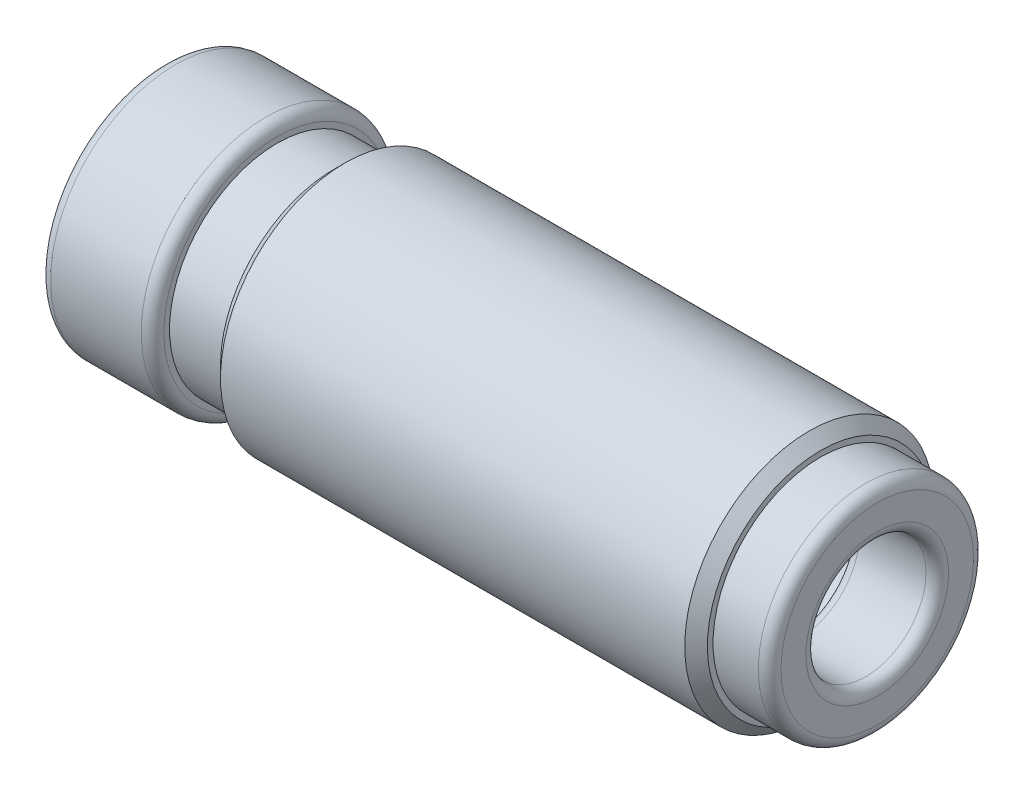
ISO-10303-21;
HEADER;
FILE_DESCRIPTION(('STEP AP214'),'2;1');
FILE_NAME('part.step','',(''),(''),'','','');
FILE_SCHEMA(('AUTOMOTIVE_DESIGN { 1 0 10303 214 1 1 1 1 }'));
ENDSEC;
DATA;
#1=APPLICATION_CONTEXT('core data for automotive mechanical design processes');
#2=APPLICATION_PROTOCOL_DEFINITION('international standard','automotive_design',2000,#1);
#3=PRODUCT_CONTEXT('',#1,'mechanical');
#4=PRODUCT('Part','Part','',(#3));
#5=PRODUCT_RELATED_PRODUCT_CATEGORY('part','',(#4));
#6=PRODUCT_DEFINITION_FORMATION('','',#4);
#7=PRODUCT_DEFINITION_CONTEXT('part definition',#1,'design');
#8=PRODUCT_DEFINITION('design','',#6,#7);
#9=PRODUCT_DEFINITION_SHAPE('','',#8);
#10=(LENGTH_UNIT() NAMED_UNIT(*) SI_UNIT(.MILLI.,.METRE.));
#11=(NAMED_UNIT(*) PLANE_ANGLE_UNIT() SI_UNIT($,.RADIAN.));
#12=(NAMED_UNIT(*) SI_UNIT($,.STERADIAN.) SOLID_ANGLE_UNIT());
#13=UNCERTAINTY_MEASURE_WITH_UNIT(LENGTH_MEASURE(1.E-05),#10,'distance_accuracy_value','');
#14=(GEOMETRIC_REPRESENTATION_CONTEXT(3) GLOBAL_UNCERTAINTY_ASSIGNED_CONTEXT((#13)) GLOBAL_UNIT_ASSIGNED_CONTEXT((#10,
#11,#12)) REPRESENTATION_CONTEXT('',''));
#15=CARTESIAN_POINT('',(0.,0.,0.));
#16=DIRECTION('',(0.,0.,1.));
#17=DIRECTION('',(1.,0.,0.));
#18=AXIS2_PLACEMENT_3D('',#15,#16,#17);
#19=CARTESIAN_POINT('',(0.,0.,0.));
#20=DIRECTION('',(-1.,0.,0.));
#21=DIRECTION('',(0.,-1.,0.));
#22=AXIS2_PLACEMENT_3D('',#19,#20,#21);
#23=PLANE('',#22);
#24=CARTESIAN_POINT('',(0.,0.,0.));
#25=DIRECTION('',(-1.,0.,0.));
#26=DIRECTION('',(0.,-1.,0.));
#27=AXIS2_PLACEMENT_3D('',#24,#25,#26);
#28=CIRCLE('',#27,10.);
#29=CARTESIAN_POINT('',(0.,-10.,0.));
#30=VERTEX_POINT('',#29);
#31=EDGE_CURVE('E73',#30,#30,#28,.T.);
#32=ORIENTED_EDGE('',*,*,#31,.T.);
#33=EDGE_LOOP('',(#32));
#34=FACE_BOUND('',#33,.T.);
#35=CARTESIAN_POINT('',(0.,0.,0.));
#36=DIRECTION('',(-1.,0.,0.));
#37=DIRECTION('',(0.,0.,1.));
#38=AXIS2_PLACEMENT_3D('',#35,#36,#37);
#39=CIRCLE('',#38,7.025);
#40=CARTESIAN_POINT('',(0.,0.,7.025));
#41=VERTEX_POINT('',#40);
#42=EDGE_CURVE('E115',#41,#41,#39,.T.);
#43=ORIENTED_EDGE('',*,*,#42,.F.);
#44=EDGE_LOOP('',(#43));
#45=FACE_BOUND('',#44,.T.);
#46=ADVANCED_FACE('F50',(#34,#45),#23,.T.);
#47=CARTESIAN_POINT('',(63.,0.,0.));
#48=DIRECTION('',(1.,0.,0.));
#49=DIRECTION('',(0.,1.,0.));
#50=AXIS2_PLACEMENT_3D('',#47,#48,#49);
#51=CYLINDRICAL_SURFACE('',#50,11.);
#52=CARTESIAN_POINT('',(1.,0.,0.));
#53=DIRECTION('',(-1.,0.,0.));
#54=DIRECTION('',(0.,-1.,0.));
#55=AXIS2_PLACEMENT_3D('',#52,#53,#54);
#56=CIRCLE('',#55,11.);
#57=CARTESIAN_POINT('',(1.,-11.,0.));
#58=VERTEX_POINT('',#57);
#59=EDGE_CURVE('E76',#58,#58,#56,.F.);
#60=ORIENTED_EDGE('',*,*,#59,.T.);
#61=EDGE_LOOP('',(#60));
#62=FACE_BOUND('',#61,.T.);
#63=CARTESIAN_POINT('',(9.00105495425073,0.,0.));
#64=DIRECTION('',(-1.,0.,0.));
#65=DIRECTION('',(0.,-1.,0.));
#66=AXIS2_PLACEMENT_3D('',#63,#64,#65);
#67=CIRCLE('',#66,11.);
#68=CARTESIAN_POINT('',(9.00105495425073,-11.,0.));
#69=VERTEX_POINT('',#68);
#70=EDGE_CURVE('E79',#69,#69,#67,.T.);
#71=ORIENTED_EDGE('',*,*,#70,.T.);
#72=EDGE_LOOP('',(#71));
#73=FACE_BOUND('',#72,.T.);
#74=ADVANCED_FACE('F122',(#62,#73),#51,.T.);
#75=CARTESIAN_POINT('',(10.0015832669539,0.,0.));
#76=DIRECTION('',(-1.,0.,0.));
#77=DIRECTION('',(0.,-1.,0.));
#78=AXIS2_PLACEMENT_3D('',#75,#76,#77);
#79=CONICAL_SURFACE('',#78,9.5,1.56974081588425);
#80=CARTESIAN_POINT('',(10.0010543971991,0.,0.));
#81=DIRECTION('',(1.,0.,0.));
#82=DIRECTION('',(0.,1.,0.));
#83=AXIS2_PLACEMENT_3D('',#80,#81,#82);
#84=CIRCLE('',#83,10.0010555107146);
#85=CARTESIAN_POINT('',(10.0010543971991,10.0010555107146,0.));
#86=VERTEX_POINT('',#85);
#87=EDGE_CURVE('E70',#86,#86,#84,.T.);
#88=ORIENTED_EDGE('',*,*,#87,.T.);
#89=EDGE_LOOP('',(#88));
#90=FACE_BOUND('',#89,.T.);
#91=CARTESIAN_POINT('',(10.0015832669539,0.,0.));
#92=DIRECTION('',(1.,0.,0.));
#93=DIRECTION('',(0.,1.,0.));
#94=AXIS2_PLACEMENT_3D('',#91,#92,#93);
#95=CIRCLE('',#94,9.5);
#96=CARTESIAN_POINT('',(10.0015832669539,9.5,0.));
#97=VERTEX_POINT('',#96);
#98=EDGE_CURVE('E100',#97,#97,#95,.T.);
#99=ORIENTED_EDGE('',*,*,#98,.F.);
#100=EDGE_LOOP('',(#99));
#101=FACE_BOUND('',#100,.T.);
#102=ADVANCED_FACE('F128',(#90,#101),#79,.T.);
#103=CARTESIAN_POINT('',(63.,0.,0.));
#104=DIRECTION('',(1.,0.,0.));
#105=DIRECTION('',(0.,1.,0.));
#106=AXIS2_PLACEMENT_3D('',#103,#104,#105);
#107=CYLINDRICAL_SURFACE('',#106,9.5);
#108=ORIENTED_EDGE('',*,*,#98,.T.);
#109=EDGE_LOOP('',(#108));
#110=FACE_BOUND('',#109,.T.);
#111=CARTESIAN_POINT('',(15.0015832669539,0.,0.));
#112=DIRECTION('',(1.,0.,0.));
#113=DIRECTION('',(0.,1.,0.));
#114=AXIS2_PLACEMENT_3D('',#111,#112,#113);
#115=CIRCLE('',#114,9.5);
#116=CARTESIAN_POINT('',(15.0015832669539,9.5,0.));
#117=VERTEX_POINT('',#116);
#118=EDGE_CURVE('E103',#117,#117,#115,.T.);
#119=ORIENTED_EDGE('',*,*,#118,.F.);
#120=EDGE_LOOP('',(#119));
#121=FACE_BOUND('',#120,.T.);
#122=ADVANCED_FACE('F177',(#110,#121),#107,.T.);
#123=CARTESIAN_POINT('',(15.0015832669539,9.5,0.));
#124=DIRECTION('',(-1.,0.,0.));
#125=DIRECTION('',(0.,-1.,0.));
#126=AXIS2_PLACEMENT_3D('',#123,#124,#125);
#127=PLANE('',#126);
#128=CARTESIAN_POINT('',(15.0015832669539,0.,0.));
#129=DIRECTION('',(-1.,0.,0.));
#130=DIRECTION('',(0.,-1.,0.));
#131=AXIS2_PLACEMENT_3D('',#128,#129,#130);
#132=CIRCLE('',#131,9.99999999999999);
#133=CARTESIAN_POINT('',(15.0015832669539,-9.99999999999999,0.));
#134=VERTEX_POINT('',#133);
#135=EDGE_CURVE('E57',#134,#134,#132,.T.);
#136=ORIENTED_EDGE('',*,*,#135,.T.);
#137=EDGE_LOOP('',(#136));
#138=FACE_BOUND('',#137,.T.);
#139=ORIENTED_EDGE('',*,*,#118,.T.);
#140=EDGE_LOOP('',(#139));
#141=FACE_BOUND('',#140,.T.);
#142=ADVANCED_FACE('F167',(#138,#141),#127,.T.);
#143=CARTESIAN_POINT('',(63.,0.,0.));
#144=DIRECTION('',(1.,0.,0.));
#145=DIRECTION('',(0.,1.,0.));
#146=AXIS2_PLACEMENT_3D('',#143,#144,#145);
#147=CYLINDRICAL_SURFACE('',#146,11.);
#148=CARTESIAN_POINT('',(16.0015832669539,0.,0.));
#149=DIRECTION('',(-1.,0.,0.));
#150=DIRECTION('',(0.,-1.,0.));
#151=AXIS2_PLACEMENT_3D('',#148,#149,#150);
#152=CIRCLE('',#151,11.);
#153=CARTESIAN_POINT('',(16.0015832669539,-11.,0.));
#154=VERTEX_POINT('',#153);
#155=EDGE_CURVE('E61',#154,#154,#152,.F.);
#156=ORIENTED_EDGE('',*,*,#155,.T.);
#157=EDGE_LOOP('',(#156));
#158=FACE_BOUND('',#157,.T.);
#159=CARTESIAN_POINT('',(57.,0.,0.));
#160=DIRECTION('',(1.,0.,0.));
#161=DIRECTION('',(0.,1.,0.));
#162=AXIS2_PLACEMENT_3D('',#159,#160,#161);
#163=CIRCLE('',#162,11.);
#164=CARTESIAN_POINT('',(57.,11.,0.));
#165=VERTEX_POINT('',#164);
#166=EDGE_CURVE('E65',#165,#165,#163,.F.);
#167=ORIENTED_EDGE('',*,*,#166,.T.);
#168=EDGE_LOOP('',(#167));
#169=FACE_BOUND('',#168,.T.);
#170=ADVANCED_FACE('F163',(#158,#169),#147,.T.);
#171=CARTESIAN_POINT('',(58.,11.,0.));
#172=DIRECTION('',(1.,0.,0.));
#173=DIRECTION('',(0.,1.,0.));
#174=AXIS2_PLACEMENT_3D('',#171,#172,#173);
#175=PLANE('',#174);
#176=CARTESIAN_POINT('',(58.,0.,0.));
#177=DIRECTION('',(1.,0.,0.));
#178=DIRECTION('',(0.,1.,0.));
#179=AXIS2_PLACEMENT_3D('',#176,#177,#178);
#180=CIRCLE('',#179,10.);
#181=CARTESIAN_POINT('',(58.,10.,0.));
#182=VERTEX_POINT('',#181);
#183=EDGE_CURVE('E12',#182,#182,#180,.T.);
#184=ORIENTED_EDGE('',*,*,#183,.T.);
#185=EDGE_LOOP('',(#184));
#186=FACE_BOUND('',#185,.T.);
#187=CARTESIAN_POINT('',(58.,0.,0.));
#188=DIRECTION('',(1.,0.,0.));
#189=DIRECTION('',(0.,1.,0.));
#190=AXIS2_PLACEMENT_3D('',#187,#188,#189);
#191=CIRCLE('',#190,9.50000000000001);
#192=CARTESIAN_POINT('',(58.,9.50000000000001,0.));
#193=VERTEX_POINT('',#192);
#194=EDGE_CURVE('E106',#193,#193,#191,.T.);
#195=ORIENTED_EDGE('',*,*,#194,.F.);
#196=EDGE_LOOP('',(#195));
#197=FACE_BOUND('',#196,.T.);
#198=ADVANCED_FACE('F166',(#186,#197),#175,.T.);
#199=CARTESIAN_POINT('',(63.,0.,0.));
#200=DIRECTION('',(1.,0.,0.));
#201=DIRECTION('',(0.,1.,0.));
#202=AXIS2_PLACEMENT_3D('',#199,#200,#201);
#203=CYLINDRICAL_SURFACE('',#202,9.50000000000001);
#204=CARTESIAN_POINT('',(62.,0.,0.));
#205=DIRECTION('',(1.,0.,0.));
#206=DIRECTION('',(0.,1.,0.));
#207=AXIS2_PLACEMENT_3D('',#204,#205,#206);
#208=CIRCLE('',#207,9.50000000000001);
#209=CARTESIAN_POINT('',(62.,9.50000000000001,0.));
#210=VERTEX_POINT('',#209);
#211=EDGE_CURVE('E91',#210,#210,#208,.F.);
#212=ORIENTED_EDGE('',*,*,#211,.T.);
#213=EDGE_LOOP('',(#212));
#214=FACE_BOUND('',#213,.T.);
#215=ORIENTED_EDGE('',*,*,#194,.T.);
#216=EDGE_LOOP('',(#215));
#217=FACE_BOUND('',#216,.T.);
#218=ADVANCED_FACE('F175',(#214,#217),#203,.T.);
#219=CARTESIAN_POINT('',(63.,9.50000000000001,0.));
#220=DIRECTION('',(1.,0.,0.));
#221=DIRECTION('',(0.,1.,0.));
#222=AXIS2_PLACEMENT_3D('',#219,#220,#221);
#223=PLANE('',#222);
#224=CARTESIAN_POINT('',(63.,0.,0.));
#225=DIRECTION('',(1.,0.,0.));
#226=DIRECTION('',(0.,1.,0.));
#227=AXIS2_PLACEMENT_3D('',#224,#225,#226);
#228=CIRCLE('',#227,8.50000000000001);
#229=CARTESIAN_POINT('',(63.,8.50000000000001,0.));
#230=VERTEX_POINT('',#229);
#231=EDGE_CURVE('E94',#230,#230,#228,.T.);
#232=ORIENTED_EDGE('',*,*,#231,.T.);
#233=EDGE_LOOP('',(#232));
#234=FACE_BOUND('',#233,.T.);
#235=CARTESIAN_POINT('',(63.,0.,0.));
#236=DIRECTION('',(1.,0.,0.));
#237=DIRECTION('',(0.,1.,0.));
#238=AXIS2_PLACEMENT_3D('',#235,#236,#237);
#239=CIRCLE('',#238,6.30000000000001);
#240=CARTESIAN_POINT('',(63.,6.30000000000001,0.));
#241=VERTEX_POINT('',#240);
#242=EDGE_CURVE('E97',#241,#241,#239,.F.);
#243=ORIENTED_EDGE('',*,*,#242,.T.);
#244=EDGE_LOOP('',(#243));
#245=FACE_BOUND('',#244,.T.);
#246=ADVANCED_FACE('F224',(#234,#245),#223,.T.);
#247=CARTESIAN_POINT('',(55.,0.,0.));
#248=DIRECTION('',(-1.,0.,0.));
#249=DIRECTION('',(0.,0.,1.));
#250=AXIS2_PLACEMENT_3D('',#247,#248,#249);
#251=CONICAL_SURFACE('',#250,6.24999999999999,1.02974425867665);
#252=CARTESIAN_POINT('',(55.2794230655618,0.,0.));
#253=DIRECTION('',(1.,0.,0.));
#254=DIRECTION('',(0.,0.,-1.));
#255=AXIS2_PLACEMENT_3D('',#252,#253,#254);
#256=CIRCLE('',#255,5.78496192508996);
#257=CARTESIAN_POINT('',(55.2794230655618,0.,-5.78496192508996));
#258=VERTEX_POINT('',#257);
#259=EDGE_CURVE('E82',#258,#258,#256,.T.);
#260=ORIENTED_EDGE('',*,*,#259,.T.);
#261=EDGE_LOOP('',(#260));
#262=FACE_BOUND('',#261,.T.);
#263=CARTESIAN_POINT('',(55.,0.,0.));
#264=DIRECTION('',(-1.,0.,0.));
#265=DIRECTION('',(0.,0.,1.));
#266=AXIS2_PLACEMENT_3D('',#263,#264,#265);
#267=CIRCLE('',#266,6.24999999999999);
#268=CARTESIAN_POINT('',(55.,0.,6.24999999999999));
#269=VERTEX_POINT('',#268);
#270=EDGE_CURVE('E109',#269,#269,#267,.T.);
#271=ORIENTED_EDGE('',*,*,#270,.T.);
#272=EDGE_LOOP('',(#271));
#273=FACE_BOUND('',#272,.T.);
#274=ADVANCED_FACE('F233',(#262,#273),#251,.F.);
#275=CARTESIAN_POINT('',(0.,0.,0.));
#276=DIRECTION('',(-1.,0.,0.));
#277=DIRECTION('',(0.,0.,1.));
#278=AXIS2_PLACEMENT_3D('',#275,#276,#277);
#279=CYLINDRICAL_SURFACE('',#278,6.24999999999999);
#280=ORIENTED_EDGE('',*,*,#270,.F.);
#281=EDGE_LOOP('',(#280));
#282=FACE_BOUND('',#281,.T.);
#283=CARTESIAN_POINT('',(0.774999999999998,0.,0.));
#284=DIRECTION('',(-1.,0.,0.));
#285=DIRECTION('',(0.,0.,1.));
#286=AXIS2_PLACEMENT_3D('',#283,#284,#285);
#287=CIRCLE('',#286,6.24999999999999);
#288=CARTESIAN_POINT('',(0.774999999999998,0.,6.24999999999999));
#289=VERTEX_POINT('',#288);
#290=EDGE_CURVE('E112',#289,#289,#287,.T.);
#291=ORIENTED_EDGE('',*,*,#290,.T.);
#292=EDGE_LOOP('',(#291));
#293=FACE_BOUND('',#292,.T.);
#294=ADVANCED_FACE('F243',(#282,#293),#279,.F.);
#295=CARTESIAN_POINT('',(0.,0.,0.));
#296=DIRECTION('',(-1.,0.,0.));
#297=DIRECTION('',(0.,0.,1.));
#298=AXIS2_PLACEMENT_3D('',#295,#296,#297);
#299=CONICAL_SURFACE('',#298,7.025,0.785398163397455);
#300=ORIENTED_EDGE('',*,*,#290,.F.);
#301=EDGE_LOOP('',(#300));
#302=FACE_BOUND('',#301,.T.);
#303=ORIENTED_EDGE('',*,*,#42,.T.);
#304=EDGE_LOOP('',(#303));
#305=FACE_BOUND('',#304,.T.);
#306=ADVANCED_FACE('F119',(#302,#305),#299,.F.);
#307=CARTESIAN_POINT('',(63.,0.,0.));
#308=DIRECTION('',(1.,0.,0.));
#309=DIRECTION('',(0.,0.,-1.));
#310=AXIS2_PLACEMENT_3D('',#307,#308,#309);
#311=CYLINDRICAL_SURFACE('',#310,5.30000000000001);
#312=CARTESIAN_POINT('',(62.,0.,0.));
#313=DIRECTION('',(1.,0.,0.));
#314=DIRECTION('',(0.,1.,0.));
#315=AXIS2_PLACEMENT_3D('',#312,#313,#314);
#316=CIRCLE('',#315,5.30000000000001);
#317=CARTESIAN_POINT('',(62.,5.30000000000001,0.));
#318=VERTEX_POINT('',#317);
#319=EDGE_CURVE('E85',#318,#318,#316,.T.);
#320=ORIENTED_EDGE('',*,*,#319,.T.);
#321=EDGE_LOOP('',(#320));
#322=FACE_BOUND('',#321,.T.);
#323=CARTESIAN_POINT('',(56.1365903662639,0.,0.));
#324=DIRECTION('',(-1.,0.,0.));
#325=DIRECTION('',(0.,0.,1.));
#326=AXIS2_PLACEMENT_3D('',#323,#324,#325);
#327=CIRCLE('',#326,5.30000000000001);
#328=CARTESIAN_POINT('',(56.1365903662639,0.,5.30000000000001));
#329=VERTEX_POINT('',#328);
#330=EDGE_CURVE('E88',#329,#329,#327,.T.);
#331=ORIENTED_EDGE('',*,*,#330,.T.);
#332=EDGE_LOOP('',(#331));
#333=FACE_BOUND('',#332,.T.);
#334=ADVANCED_FACE('F137',(#322,#333),#311,.F.);
#335=CARTESIAN_POINT('',(62.,0.,0.));
#336=DIRECTION('',(1.,0.,0.));
#337=DIRECTION('',(0.,1.,0.));
#338=AXIS2_PLACEMENT_3D('',#335,#336,#337);
#339=TOROIDAL_SURFACE('',#338,8.50000000000001,1.);
#340=ORIENTED_EDGE('',*,*,#211,.F.);
#341=EDGE_LOOP('',(#340));
#342=FACE_BOUND('',#341,.T.);
#343=ORIENTED_EDGE('',*,*,#231,.F.);
#344=EDGE_LOOP('',(#343));
#345=FACE_BOUND('',#344,.T.);
#346=ADVANCED_FACE('F133',(#342,#345),#339,.T.);
#347=CARTESIAN_POINT('',(62.,0.,0.));
#348=DIRECTION('',(1.,0.,0.));
#349=DIRECTION('',(0.,1.,0.));
#350=AXIS2_PLACEMENT_3D('',#347,#348,#349);
#351=TOROIDAL_SURFACE('',#350,6.30000000000001,1.);
#352=ORIENTED_EDGE('',*,*,#242,.F.);
#353=EDGE_LOOP('',(#352));
#354=FACE_BOUND('',#353,.T.);
#355=ORIENTED_EDGE('',*,*,#319,.F.);
#356=EDGE_LOOP('',(#355));
#357=FACE_BOUND('',#356,.T.);
#358=ADVANCED_FACE('F136',(#354,#357),#351,.T.);
#359=CARTESIAN_POINT('',(56.1365903662639,0.,0.));
#360=DIRECTION('',(-1.,0.,0.));
#361=DIRECTION('',(0.,0.,1.));
#362=AXIS2_PLACEMENT_3D('',#359,#360,#361);
#363=TOROIDAL_SURFACE('',#362,6.30000000000001,1.);
#364=ORIENTED_EDGE('',*,*,#330,.F.);
#365=EDGE_LOOP('',(#364));
#366=FACE_BOUND('',#365,.T.);
#367=ORIENTED_EDGE('',*,*,#259,.F.);
#368=EDGE_LOOP('',(#367));
#369=FACE_BOUND('',#368,.T.);
#370=ADVANCED_FACE('F141',(#366,#369),#363,.T.);
#371=CARTESIAN_POINT('',(1.,0.,0.));
#372=DIRECTION('',(-1.,0.,0.));
#373=DIRECTION('',(0.,-1.,0.));
#374=AXIS2_PLACEMENT_3D('',#371,#372,#373);
#375=TOROIDAL_SURFACE('',#374,10.,1.);
#376=ORIENTED_EDGE('',*,*,#31,.F.);
#377=EDGE_LOOP('',(#376));
#378=FACE_BOUND('',#377,.T.);
#379=ORIENTED_EDGE('',*,*,#59,.F.);
#380=EDGE_LOOP('',(#379));
#381=FACE_BOUND('',#380,.T.);
#382=ADVANCED_FACE('F145',(#378,#381),#375,.T.);
#383=CARTESIAN_POINT('',(9.00105495425073,0.,0.));
#384=DIRECTION('',(-1.,0.,0.));
#385=DIRECTION('',(0.,-1.,0.));
#386=AXIS2_PLACEMENT_3D('',#383,#384,#385);
#387=TOROIDAL_SURFACE('',#386,10.,1.);
#388=ORIENTED_EDGE('',*,*,#70,.F.);
#389=EDGE_LOOP('',(#388));
#390=FACE_BOUND('',#389,.T.);
#391=ORIENTED_EDGE('',*,*,#87,.F.);
#392=EDGE_LOOP('',(#391));
#393=FACE_BOUND('',#392,.T.);
#394=ADVANCED_FACE('F149',(#390,#393),#387,.T.);
#395=CARTESIAN_POINT('',(16.0015832669539,0.,0.));
#396=DIRECTION('',(1.,0.,0.));
#397=DIRECTION('',(0.,1.,0.));
#398=AXIS2_PLACEMENT_3D('',#395,#396,#397);
#399=CONICAL_SURFACE('',#398,11.,0.785398163397456);
#400=ORIENTED_EDGE('',*,*,#135,.F.);
#401=EDGE_LOOP('',(#400));
#402=FACE_BOUND('',#401,.T.);
#403=ORIENTED_EDGE('',*,*,#155,.F.);
#404=EDGE_LOOP('',(#403));
#405=FACE_BOUND('',#404,.T.);
#406=ADVANCED_FACE('F152',(#402,#405),#399,.T.);
#407=CARTESIAN_POINT('',(58.,0.,0.));
#408=DIRECTION('',(-1.,0.,0.));
#409=DIRECTION('',(0.,-1.,0.));
#410=AXIS2_PLACEMENT_3D('',#407,#408,#409);
#411=CONICAL_SURFACE('',#410,10.,0.785398163397452);
#412=ORIENTED_EDGE('',*,*,#166,.F.);
#413=EDGE_LOOP('',(#412));
#414=FACE_BOUND('',#413,.T.);
#415=ORIENTED_EDGE('',*,*,#183,.F.);
#416=EDGE_LOOP('',(#415));
#417=FACE_BOUND('',#416,.T.);
#418=ADVANCED_FACE('F52',(#414,#417),#411,.T.);
#419=CLOSED_SHELL('',(#46,#74,#102,#122,#142,#170,#198,#218,#246,#274,#294,#306,#334,#346,#358,
#370,#382,#394,#406,#418));
#420=MANIFOLD_SOLID_BREP('B2',#419);
#421=ADVANCED_BREP_SHAPE_REPRESENTATION('',(#18,#420),#14);
#422=SHAPE_DEFINITION_REPRESENTATION(#9,#421);
ENDSEC;
END-ISO-10303-21;
